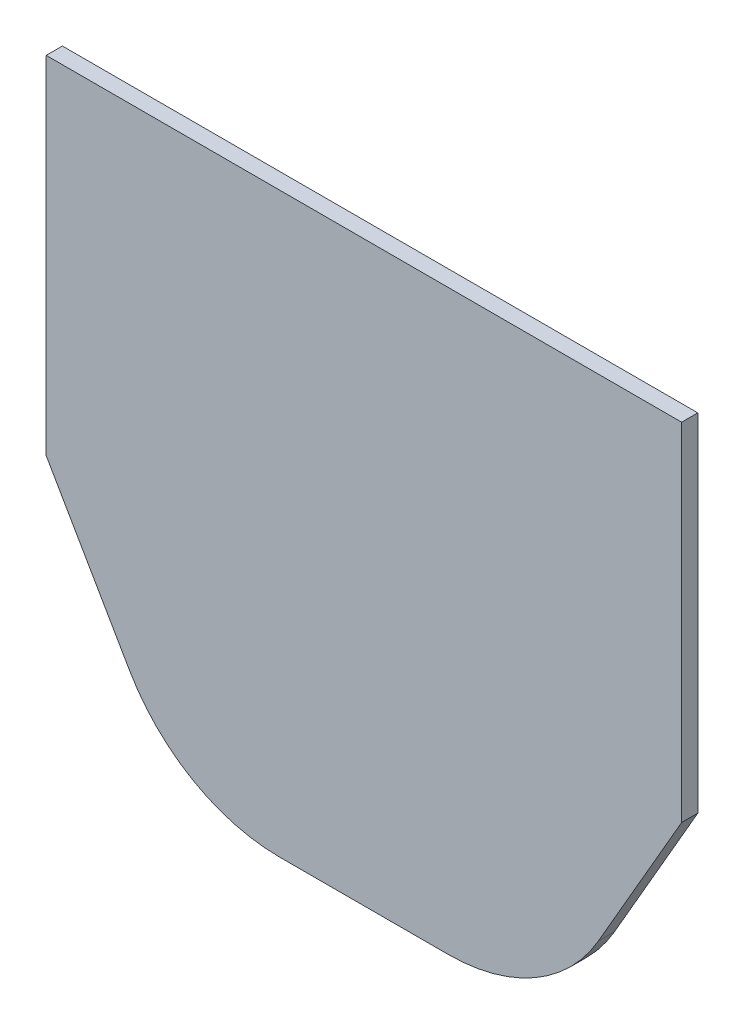
ISO-10303-21;
HEADER;
FILE_DESCRIPTION(('STEP AP214'),'2;1');
FILE_NAME('part.step','',(''),(''),'','','');
FILE_SCHEMA(('AUTOMOTIVE_DESIGN { 1 0 10303 214 1 1 1 1 }'));
ENDSEC;
DATA;
#1=APPLICATION_CONTEXT('core data for automotive mechanical design processes');
#2=APPLICATION_PROTOCOL_DEFINITION('international standard','automotive_design',2000,#1);
#3=PRODUCT_CONTEXT('',#1,'mechanical');
#4=PRODUCT('Part','Part','',(#3));
#5=PRODUCT_RELATED_PRODUCT_CATEGORY('part','',(#4));
#6=PRODUCT_DEFINITION_FORMATION('','',#4);
#7=PRODUCT_DEFINITION_CONTEXT('part definition',#1,'design');
#8=PRODUCT_DEFINITION('design','',#6,#7);
#9=PRODUCT_DEFINITION_SHAPE('','',#8);
#10=(LENGTH_UNIT() NAMED_UNIT(*) SI_UNIT(.MILLI.,.METRE.));
#11=(NAMED_UNIT(*) PLANE_ANGLE_UNIT() SI_UNIT($,.RADIAN.));
#12=(NAMED_UNIT(*) SI_UNIT($,.STERADIAN.) SOLID_ANGLE_UNIT());
#13=UNCERTAINTY_MEASURE_WITH_UNIT(LENGTH_MEASURE(1.E-05),#10,'distance_accuracy_value','');
#14=(GEOMETRIC_REPRESENTATION_CONTEXT(3) GLOBAL_UNCERTAINTY_ASSIGNED_CONTEXT((#13)) GLOBAL_UNIT_ASSIGNED_CONTEXT((#10,
#11,#12)) REPRESENTATION_CONTEXT('',''));
#15=CARTESIAN_POINT('',(0.,0.,0.));
#16=DIRECTION('',(0.,0.,1.));
#17=DIRECTION('',(1.,0.,0.));
#18=AXIS2_PLACEMENT_3D('',#15,#16,#17);
#19=CARTESIAN_POINT('',(-301.199532210275,280.561645895682,-3.556));
#20=DIRECTION('',(-0.86602540378444,-0.499999999999998,0.));
#21=DIRECTION('',(0.499999999999998,-0.86602540378444,0.));
#22=AXIS2_PLACEMENT_3D('',#19,#20,#21);
#23=PLANE('',#22);
#24=DIRECTION('',(0.499999999999998,-0.86602540378444,0.));
#25=VECTOR('',#24,1.);
#26=CARTESIAN_POINT('',(-301.199532210275,280.561645895682,0.));
#27=LINE('',#26,#25);
#28=CARTESIAN_POINT('',(-301.199532210275,280.561645895682,0.));
#29=VERTEX_POINT('',#28);
#30=CARTESIAN_POINT('',(-282.884212388359,248.83858140725,0.));
#31=VERTEX_POINT('',#30);
#32=EDGE_CURVE('E129',#29,#31,#27,.T.);
#33=ORIENTED_EDGE('',*,*,#32,.F.);
#34=DIRECTION('',(0.,0.,1.));
#35=VECTOR('',#34,1.);
#36=CARTESIAN_POINT('',(-301.199532210275,280.561645895682,-3.556));
#37=LINE('',#36,#35);
#38=CARTESIAN_POINT('',(-301.199532210275,280.561645895682,-3.556));
#39=VERTEX_POINT('',#38);
#40=EDGE_CURVE('E11',#39,#29,#37,.T.);
#41=ORIENTED_EDGE('',*,*,#40,.F.);
#42=DIRECTION('',(0.499999999999998,-0.86602540378444,0.));
#43=VECTOR('',#42,1.);
#44=CARTESIAN_POINT('',(-301.199532210275,280.561645895682,-3.556));
#45=LINE('',#44,#43);
#46=CARTESIAN_POINT('',(-282.884212388359,248.83858140725,-3.556));
#47=VERTEX_POINT('',#46);
#48=EDGE_CURVE('E148',#39,#47,#45,.T.);
#49=ORIENTED_EDGE('',*,*,#48,.T.);
#50=DIRECTION('',(0.,0.,1.));
#51=VECTOR('',#50,1.);
#52=CARTESIAN_POINT('',(-282.884212388359,248.83858140725,-3.556));
#53=LINE('',#52,#51);
#54=EDGE_CURVE('E35',#47,#31,#53,.T.);
#55=ORIENTED_EDGE('',*,*,#54,.T.);
#56=EDGE_LOOP('',(#33,#41,#49,#55));
#57=FACE_BOUND('',#56,.T.);
#58=ADVANCED_FACE('F32',(#57),#23,.T.);
#59=CARTESIAN_POINT('',(-301.199532210275,280.561645895682,-3.556));
#60=DIRECTION('',(1.,0.,0.));
#61=DIRECTION('',(0.,0.,-1.));
#62=AXIS2_PLACEMENT_3D('',#59,#60,#61);
#63=PLANE('',#62);
#64=DIRECTION('',(0.,1.,0.));
#65=VECTOR('',#64,1.);
#66=CARTESIAN_POINT('',(-301.199532210275,280.561645895682,0.));
#67=LINE('',#66,#65);
#68=CARTESIAN_POINT('',(-301.199532210275,356.78858140725,0.));
#69=VERTEX_POINT('',#68);
#70=EDGE_CURVE('E147',#29,#69,#67,.T.);
#71=ORIENTED_EDGE('',*,*,#70,.T.);
#72=DIRECTION('',(0.,0.,1.));
#73=VECTOR('',#72,1.);
#74=CARTESIAN_POINT('',(-301.199532210275,356.78858140725,-3.556));
#75=LINE('',#74,#73);
#76=CARTESIAN_POINT('',(-301.199532210275,356.78858140725,-3.556));
#77=VERTEX_POINT('',#76);
#78=EDGE_CURVE('E41',#77,#69,#75,.T.);
#79=ORIENTED_EDGE('',*,*,#78,.F.);
#80=DIRECTION('',(0.,1.,0.));
#81=VECTOR('',#80,1.);
#82=CARTESIAN_POINT('',(-301.199532210275,280.561645895682,-3.556));
#83=LINE('',#82,#81);
#84=EDGE_CURVE('E118',#39,#77,#83,.T.);
#85=ORIENTED_EDGE('',*,*,#84,.F.);
#86=ORIENTED_EDGE('',*,*,#40,.T.);
#87=EDGE_LOOP('',(#71,#79,#85,#86));
#88=FACE_BOUND('',#87,.T.);
#89=ADVANCED_FACE('F160',(#88),#63,.F.);
#90=CARTESIAN_POINT('',(-161.499532603587,356.78858140725,-3.556));
#91=DIRECTION('',(0.,1.,0.));
#92=DIRECTION('',(0.,0.,1.));
#93=AXIS2_PLACEMENT_3D('',#90,#91,#92);
#94=PLANE('',#93);
#95=DIRECTION('',(-1.,0.,0.));
#96=VECTOR('',#95,1.);
#97=CARTESIAN_POINT('',(-161.499532603587,356.78858140725,0.));
#98=LINE('',#97,#96);
#99=CARTESIAN_POINT('',(-161.499532603587,356.78858140725,0.));
#100=VERTEX_POINT('',#99);
#101=EDGE_CURVE('E106',#100,#69,#98,.T.);
#102=ORIENTED_EDGE('',*,*,#101,.F.);
#103=DIRECTION('',(0.,0.,1.));
#104=VECTOR('',#103,1.);
#105=CARTESIAN_POINT('',(-161.499532603587,356.78858140725,-3.556));
#106=LINE('',#105,#104);
#107=CARTESIAN_POINT('',(-161.499532603587,356.78858140725,-3.556));
#108=VERTEX_POINT('',#107);
#109=EDGE_CURVE('E101',#108,#100,#106,.T.);
#110=ORIENTED_EDGE('',*,*,#109,.F.);
#111=DIRECTION('',(-1.,0.,0.));
#112=VECTOR('',#111,1.);
#113=CARTESIAN_POINT('',(-161.499532603587,356.78858140725,-3.556));
#114=LINE('',#113,#112);
#115=EDGE_CURVE('E104',#108,#77,#114,.T.);
#116=ORIENTED_EDGE('',*,*,#115,.T.);
#117=ORIENTED_EDGE('',*,*,#78,.T.);
#118=EDGE_LOOP('',(#102,#110,#116,#117));
#119=FACE_BOUND('',#118,.T.);
#120=ADVANCED_FACE('F103',(#119),#94,.T.);
#121=CARTESIAN_POINT('',(-161.499532603587,280.561645895682,-3.556));
#122=DIRECTION('',(1.,0.,0.));
#123=DIRECTION('',(0.,0.,-1.));
#124=AXIS2_PLACEMENT_3D('',#121,#122,#123);
#125=PLANE('',#124);
#126=DIRECTION('',(0.,1.,0.));
#127=VECTOR('',#126,1.);
#128=CARTESIAN_POINT('',(-161.499532603587,280.561645895682,0.));
#129=LINE('',#128,#127);
#130=CARTESIAN_POINT('',(-161.499532603587,280.561645895682,0.));
#131=VERTEX_POINT('',#130);
#132=EDGE_CURVE('E144',#131,#100,#129,.T.);
#133=ORIENTED_EDGE('',*,*,#132,.F.);
#134=DIRECTION('',(0.,0.,1.));
#135=VECTOR('',#134,1.);
#136=CARTESIAN_POINT('',(-161.499532603587,280.561645895682,-3.556));
#137=LINE('',#136,#135);
#138=CARTESIAN_POINT('',(-161.499532603587,280.561645895682,-3.556));
#139=VERTEX_POINT('',#138);
#140=EDGE_CURVE('E111',#139,#131,#137,.T.);
#141=ORIENTED_EDGE('',*,*,#140,.F.);
#142=DIRECTION('',(0.,1.,0.));
#143=VECTOR('',#142,1.);
#144=CARTESIAN_POINT('',(-161.499532603587,280.561645895682,-3.556));
#145=LINE('',#144,#143);
#146=EDGE_CURVE('E117',#139,#108,#145,.T.);
#147=ORIENTED_EDGE('',*,*,#146,.T.);
#148=ORIENTED_EDGE('',*,*,#109,.T.);
#149=EDGE_LOOP('',(#133,#141,#147,#148));
#150=FACE_BOUND('',#149,.T.);
#151=ADVANCED_FACE('F120',(#150),#125,.T.);
#152=CARTESIAN_POINT('',(-161.499532603587,280.561645895682,-3.556));
#153=DIRECTION('',(-0.86602540378444,0.499999999999998,0.));
#154=DIRECTION('',(-0.499999999999998,-0.86602540378444,0.));
#155=AXIS2_PLACEMENT_3D('',#152,#153,#154);
#156=PLANE('',#155);
#157=DIRECTION('',(-0.499999999999998,-0.86602540378444,0.));
#158=VECTOR('',#157,1.);
#159=CARTESIAN_POINT('',(-161.499532603587,280.561645895682,0.));
#160=LINE('',#159,#158);
#161=CARTESIAN_POINT('',(-179.814852425503,248.83858140725,0.));
#162=VERTEX_POINT('',#161);
#163=EDGE_CURVE('E141',#131,#162,#160,.T.);
#164=ORIENTED_EDGE('',*,*,#163,.T.);
#165=DIRECTION('',(0.,0.,1.));
#166=VECTOR('',#165,1.);
#167=CARTESIAN_POINT('',(-179.814852425503,248.83858140725,-3.556));
#168=LINE('',#167,#166);
#169=CARTESIAN_POINT('',(-179.814852425503,248.83858140725,-3.556));
#170=VERTEX_POINT('',#169);
#171=EDGE_CURVE('E152',#170,#162,#168,.T.);
#172=ORIENTED_EDGE('',*,*,#171,.F.);
#173=DIRECTION('',(-0.499999999999998,-0.86602540378444,0.));
#174=VECTOR('',#173,1.);
#175=CARTESIAN_POINT('',(-161.499532603587,280.561645895682,-3.556));
#176=LINE('',#175,#174);
#177=EDGE_CURVE('E122',#139,#170,#176,.T.);
#178=ORIENTED_EDGE('',*,*,#177,.F.);
#179=ORIENTED_EDGE('',*,*,#140,.T.);
#180=EDGE_LOOP('',(#164,#172,#178,#179));
#181=FACE_BOUND('',#180,.T.);
#182=ADVANCED_FACE('F178',(#181),#156,.F.);
#183=CARTESIAN_POINT('',(-212.81042030969,267.88858140725,-3.556));
#184=DIRECTION('',(0.,0.,1.));
#185=DIRECTION('',(1.,0.,0.));
#186=AXIS2_PLACEMENT_3D('',#183,#184,#185);
#187=CYLINDRICAL_SURFACE('',#186,38.1);
#188=CARTESIAN_POINT('',(-212.81042030969,267.88858140725,0.));
#189=DIRECTION('',(0.,0.,1.));
#190=DIRECTION('',(1.,0.,0.));
#191=AXIS2_PLACEMENT_3D('',#188,#189,#190);
#192=CIRCLE('',#191,38.1);
#193=CARTESIAN_POINT('',(-212.81042030969,229.78858140725,0.));
#194=VERTEX_POINT('',#193);
#195=EDGE_CURVE('E138',#194,#162,#192,.T.);
#196=ORIENTED_EDGE('',*,*,#195,.F.);
#197=DIRECTION('',(0.,0.,1.));
#198=VECTOR('',#197,1.);
#199=CARTESIAN_POINT('',(-212.81042030969,229.78858140725,-3.556));
#200=LINE('',#199,#198);
#201=CARTESIAN_POINT('',(-212.81042030969,229.78858140725,-3.556));
#202=VERTEX_POINT('',#201);
#203=EDGE_CURVE('E154',#202,#194,#200,.T.);
#204=ORIENTED_EDGE('',*,*,#203,.F.);
#205=CARTESIAN_POINT('',(-212.81042030969,267.88858140725,-3.556));
#206=DIRECTION('',(0.,0.,1.));
#207=DIRECTION('',(1.,0.,0.));
#208=AXIS2_PLACEMENT_3D('',#205,#206,#207);
#209=CIRCLE('',#208,38.1);
#210=EDGE_CURVE('E124',#202,#170,#209,.T.);
#211=ORIENTED_EDGE('',*,*,#210,.T.);
#212=ORIENTED_EDGE('',*,*,#171,.T.);
#213=EDGE_LOOP('',(#196,#204,#211,#212));
#214=FACE_BOUND('',#213,.T.);
#215=ADVANCED_FACE('F172',(#214),#187,.T.);
#216=CARTESIAN_POINT('',(-249.888644504172,229.78858140725,-3.556));
#217=DIRECTION('',(0.,-1.,0.));
#218=DIRECTION('',(0.,0.,-1.));
#219=AXIS2_PLACEMENT_3D('',#216,#217,#218);
#220=PLANE('',#219);
#221=DIRECTION('',(1.,0.,0.));
#222=VECTOR('',#221,1.);
#223=CARTESIAN_POINT('',(-249.888644504172,229.78858140725,0.));
#224=LINE('',#223,#222);
#225=CARTESIAN_POINT('',(-249.888644504172,229.78858140725,0.));
#226=VERTEX_POINT('',#225);
#227=EDGE_CURVE('E135',#226,#194,#224,.T.);
#228=ORIENTED_EDGE('',*,*,#227,.F.);
#229=DIRECTION('',(0.,0.,1.));
#230=VECTOR('',#229,1.);
#231=CARTESIAN_POINT('',(-249.888644504172,229.78858140725,-3.556));
#232=LINE('',#231,#230);
#233=CARTESIAN_POINT('',(-249.888644504172,229.78858140725,-3.556));
#234=VERTEX_POINT('',#233);
#235=EDGE_CURVE('E155',#234,#226,#232,.T.);
#236=ORIENTED_EDGE('',*,*,#235,.F.);
#237=DIRECTION('',(1.,0.,0.));
#238=VECTOR('',#237,1.);
#239=CARTESIAN_POINT('',(-249.888644504172,229.78858140725,-3.556));
#240=LINE('',#239,#238);
#241=EDGE_CURVE('E164',#234,#202,#240,.T.);
#242=ORIENTED_EDGE('',*,*,#241,.T.);
#243=ORIENTED_EDGE('',*,*,#203,.T.);
#244=EDGE_LOOP('',(#228,#236,#242,#243));
#245=FACE_BOUND('',#244,.T.);
#246=ADVANCED_FACE('F175',(#245),#220,.T.);
#247=CARTESIAN_POINT('',(-249.888644504172,267.88858140725,-3.556));
#248=DIRECTION('',(0.,0.,1.));
#249=DIRECTION('',(1.,0.,0.));
#250=AXIS2_PLACEMENT_3D('',#247,#248,#249);
#251=CYLINDRICAL_SURFACE('',#250,38.1);
#252=CARTESIAN_POINT('',(-249.888644504172,267.88858140725,0.));
#253=DIRECTION('',(0.,0.,1.));
#254=DIRECTION('',(1.,0.,0.));
#255=AXIS2_PLACEMENT_3D('',#252,#253,#254);
#256=CIRCLE('',#255,38.1);
#257=EDGE_CURVE('E132',#31,#226,#256,.T.);
#258=ORIENTED_EDGE('',*,*,#257,.F.);
#259=ORIENTED_EDGE('',*,*,#54,.F.);
#260=CARTESIAN_POINT('',(-249.888644504172,267.88858140725,-3.556));
#261=DIRECTION('',(0.,0.,1.));
#262=DIRECTION('',(1.,0.,0.));
#263=AXIS2_PLACEMENT_3D('',#260,#261,#262);
#264=CIRCLE('',#263,38.1);
#265=EDGE_CURVE('E162',#47,#234,#264,.T.);
#266=ORIENTED_EDGE('',*,*,#265,.T.);
#267=ORIENTED_EDGE('',*,*,#235,.T.);
#268=EDGE_LOOP('',(#258,#259,#266,#267));
#269=FACE_BOUND('',#268,.T.);
#270=ADVANCED_FACE('F157',(#269),#251,.T.);
#271=CARTESIAN_POINT('',(-249.888644504172,267.88858140725,-3.556));
#272=DIRECTION('',(0.,0.,1.));
#273=DIRECTION('',(1.,0.,0.));
#274=AXIS2_PLACEMENT_3D('',#271,#272,#273);
#275=PLANE('',#274);
#276=ORIENTED_EDGE('',*,*,#48,.F.);
#277=ORIENTED_EDGE('',*,*,#84,.T.);
#278=ORIENTED_EDGE('',*,*,#115,.F.);
#279=ORIENTED_EDGE('',*,*,#146,.F.);
#280=ORIENTED_EDGE('',*,*,#177,.T.);
#281=ORIENTED_EDGE('',*,*,#210,.F.);
#282=ORIENTED_EDGE('',*,*,#241,.F.);
#283=ORIENTED_EDGE('',*,*,#265,.F.);
#284=EDGE_LOOP('',(#276,#277,#278,#279,#280,#281,#282,#283));
#285=FACE_BOUND('',#284,.T.);
#286=ADVANCED_FACE('F116',(#285),#275,.F.);
#287=CARTESIAN_POINT('',(-249.888644504172,267.88858140725,0.));
#288=DIRECTION('',(0.,0.,1.));
#289=DIRECTION('',(1.,0.,0.));
#290=AXIS2_PLACEMENT_3D('',#287,#288,#289);
#291=PLANE('',#290);
#292=ORIENTED_EDGE('',*,*,#32,.T.);
#293=ORIENTED_EDGE('',*,*,#257,.T.);
#294=ORIENTED_EDGE('',*,*,#227,.T.);
#295=ORIENTED_EDGE('',*,*,#195,.T.);
#296=ORIENTED_EDGE('',*,*,#163,.F.);
#297=ORIENTED_EDGE('',*,*,#132,.T.);
#298=ORIENTED_EDGE('',*,*,#101,.T.);
#299=ORIENTED_EDGE('',*,*,#70,.F.);
#300=EDGE_LOOP('',(#292,#293,#294,#295,#296,#297,#298,#299));
#301=FACE_BOUND('',#300,.T.);
#302=ADVANCED_FACE('F159',(#301),#291,.T.);
#303=CLOSED_SHELL('',(#58,#89,#120,#151,#182,#215,#246,#270,#286,#302));
#304=MANIFOLD_SOLID_BREP('B2',#303);
#305=ADVANCED_BREP_SHAPE_REPRESENTATION('',(#18,#304),#14);
#306=SHAPE_DEFINITION_REPRESENTATION(#9,#305);
ENDSEC;
END-ISO-10303-21;
